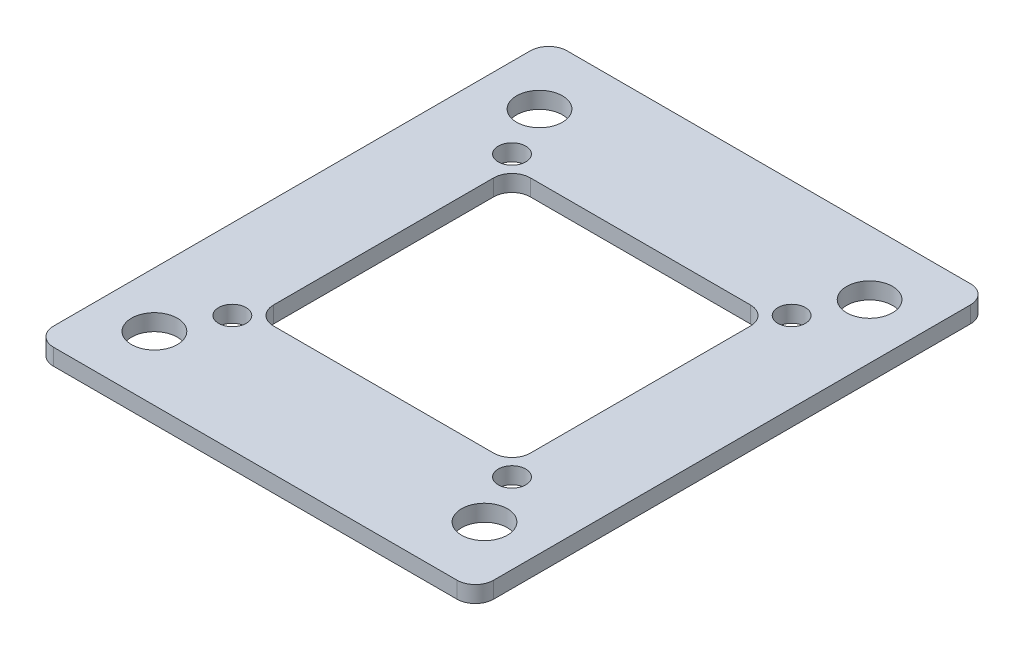
ISO-10303-21;
HEADER;
FILE_DESCRIPTION(('STEP AP214'),'2;1');
FILE_NAME('part.step','',(''),(''),'','','');
FILE_SCHEMA(('AUTOMOTIVE_DESIGN { 1 0 10303 214 1 1 1 1 }'));
ENDSEC;
DATA;
#1=APPLICATION_CONTEXT('core data for automotive mechanical design processes');
#2=APPLICATION_PROTOCOL_DEFINITION('international standard','automotive_design',2000,#1);
#3=PRODUCT_CONTEXT('',#1,'mechanical');
#4=PRODUCT('Part','Part','',(#3));
#5=PRODUCT_RELATED_PRODUCT_CATEGORY('part','',(#4));
#6=PRODUCT_DEFINITION_FORMATION('','',#4);
#7=PRODUCT_DEFINITION_CONTEXT('part definition',#1,'design');
#8=PRODUCT_DEFINITION('design','',#6,#7);
#9=PRODUCT_DEFINITION_SHAPE('','',#8);
#10=(LENGTH_UNIT() NAMED_UNIT(*) SI_UNIT(.MILLI.,.METRE.));
#11=(NAMED_UNIT(*) PLANE_ANGLE_UNIT() SI_UNIT($,.RADIAN.));
#12=(NAMED_UNIT(*) SI_UNIT($,.STERADIAN.) SOLID_ANGLE_UNIT());
#13=UNCERTAINTY_MEASURE_WITH_UNIT(LENGTH_MEASURE(1.E-05),#10,'distance_accuracy_value','');
#14=(GEOMETRIC_REPRESENTATION_CONTEXT(3) GLOBAL_UNCERTAINTY_ASSIGNED_CONTEXT((#13)) GLOBAL_UNIT_ASSIGNED_CONTEXT((#10,
#11,#12)) REPRESENTATION_CONTEXT('',''));
#15=CARTESIAN_POINT('',(0.,0.,0.));
#16=DIRECTION('',(0.,0.,1.));
#17=DIRECTION('',(1.,0.,0.));
#18=AXIS2_PLACEMENT_3D('',#15,#16,#17);
#19=CARTESIAN_POINT('',(0.,1.8,0.));
#20=DIRECTION('',(0.,-1.,0.));
#21=DIRECTION('',(0.,0.,-1.));
#22=AXIS2_PLACEMENT_3D('',#19,#20,#21);
#23=PLANE('',#22);
#24=CARTESIAN_POINT('',(-15.2500000000001,1.8,15.25));
#25=DIRECTION('',(0.,1.,0.));
#26=DIRECTION('',(0.,0.,1.));
#27=AXIS2_PLACEMENT_3D('',#24,#25,#26);
#28=CIRCLE('',#27,1.5);
#29=CARTESIAN_POINT('',(-15.2500000000001,1.8,16.75));
#30=VERTEX_POINT('',#29);
#31=EDGE_CURVE('E320',#30,#30,#28,.T.);
#32=ORIENTED_EDGE('',*,*,#31,.F.);
#33=EDGE_LOOP('',(#32));
#34=FACE_BOUND('',#33,.T.);
#35=CARTESIAN_POINT('',(15.25,1.8,15.25));
#36=DIRECTION('',(0.,1.,0.));
#37=DIRECTION('',(0.,0.,-1.));
#38=AXIS2_PLACEMENT_3D('',#35,#36,#37);
#39=CIRCLE('',#38,1.5);
#40=CARTESIAN_POINT('',(15.25,1.8,13.75));
#41=VERTEX_POINT('',#40);
#42=EDGE_CURVE('E326',#41,#41,#39,.T.);
#43=ORIENTED_EDGE('',*,*,#42,.F.);
#44=EDGE_LOOP('',(#43));
#45=FACE_BOUND('',#44,.T.);
#46=CARTESIAN_POINT('',(-15.2500000000001,1.8,-15.25));
#47=DIRECTION('',(0.,1.,0.));
#48=DIRECTION('',(0.,0.,-1.));
#49=AXIS2_PLACEMENT_3D('',#46,#47,#48);
#50=CIRCLE('',#49,1.5);
#51=CARTESIAN_POINT('',(-15.2500000000001,1.8,-16.75));
#52=VERTEX_POINT('',#51);
#53=EDGE_CURVE('E332',#52,#52,#50,.T.);
#54=ORIENTED_EDGE('',*,*,#53,.F.);
#55=EDGE_LOOP('',(#54));
#56=FACE_BOUND('',#55,.T.);
#57=CARTESIAN_POINT('',(15.25,1.8,-15.25));
#58=DIRECTION('',(0.,1.,0.));
#59=DIRECTION('',(0.,0.,1.));
#60=AXIS2_PLACEMENT_3D('',#57,#58,#59);
#61=CIRCLE('',#60,1.5);
#62=CARTESIAN_POINT('',(15.25,1.8,-13.75));
#63=VERTEX_POINT('',#62);
#64=EDGE_CURVE('E181',#63,#63,#61,.T.);
#65=ORIENTED_EDGE('',*,*,#64,.F.);
#66=EDGE_LOOP('',(#65));
#67=FACE_BOUND('',#66,.T.);
#68=DIRECTION('',(-1.,0.,0.));
#69=VECTOR('',#68,1.);
#70=CARTESIAN_POINT('',(-14.,1.8,-14.));
#71=LINE('',#70,#69);
#72=CARTESIAN_POINT('',(12.,1.8,-14.));
#73=VERTEX_POINT('',#72);
#74=CARTESIAN_POINT('',(-12.,1.8,-14.));
#75=VERTEX_POINT('',#74);
#76=EDGE_CURVE('E174',#73,#75,#71,.T.);
#77=ORIENTED_EDGE('',*,*,#76,.F.);
#78=CARTESIAN_POINT('',(12.,1.8,-12.));
#79=DIRECTION('',(0.,-1.,0.));
#80=DIRECTION('',(0.,0.,-1.));
#81=AXIS2_PLACEMENT_3D('',#78,#79,#80);
#82=CIRCLE('',#81,2.);
#83=CARTESIAN_POINT('',(14.,1.8,-12.));
#84=VERTEX_POINT('',#83);
#85=EDGE_CURVE('E43',#73,#84,#82,.T.);
#86=ORIENTED_EDGE('',*,*,#85,.T.);
#87=DIRECTION('',(0.,0.,-1.));
#88=VECTOR('',#87,1.);
#89=CARTESIAN_POINT('',(14.,1.8,14.));
#90=LINE('',#89,#88);
#91=CARTESIAN_POINT('',(14.,1.8,12.));
#92=VERTEX_POINT('',#91);
#93=EDGE_CURVE('E166',#92,#84,#90,.T.);
#94=ORIENTED_EDGE('',*,*,#93,.F.);
#95=CARTESIAN_POINT('',(12.,1.8,12.));
#96=DIRECTION('',(0.,-1.,0.));
#97=DIRECTION('',(0.,0.,-1.));
#98=AXIS2_PLACEMENT_3D('',#95,#96,#97);
#99=CIRCLE('',#98,2.);
#100=CARTESIAN_POINT('',(12.,1.8,14.));
#101=VERTEX_POINT('',#100);
#102=EDGE_CURVE('E149',#92,#101,#99,.T.);
#103=ORIENTED_EDGE('',*,*,#102,.T.);
#104=DIRECTION('',(1.,0.,0.));
#105=VECTOR('',#104,1.);
#106=CARTESIAN_POINT('',(-14.,1.8,14.));
#107=LINE('',#106,#105);
#108=CARTESIAN_POINT('',(-12.,1.8,14.));
#109=VERTEX_POINT('',#108);
#110=EDGE_CURVE('E189',#109,#101,#107,.T.);
#111=ORIENTED_EDGE('',*,*,#110,.F.);
#112=CARTESIAN_POINT('',(-12.,1.8,12.));
#113=DIRECTION('',(0.,-1.,0.));
#114=DIRECTION('',(0.,0.,-1.));
#115=AXIS2_PLACEMENT_3D('',#112,#113,#114);
#116=CIRCLE('',#115,2.);
#117=CARTESIAN_POINT('',(-14.,1.8,12.));
#118=VERTEX_POINT('',#117);
#119=EDGE_CURVE('E284',#109,#118,#116,.T.);
#120=ORIENTED_EDGE('',*,*,#119,.T.);
#121=DIRECTION('',(0.,0.,1.));
#122=VECTOR('',#121,1.);
#123=CARTESIAN_POINT('',(-14.,1.8,14.));
#124=LINE('',#123,#122);
#125=CARTESIAN_POINT('',(-14.,1.8,-12.));
#126=VERTEX_POINT('',#125);
#127=EDGE_CURVE('E178',#126,#118,#124,.T.);
#128=ORIENTED_EDGE('',*,*,#127,.F.);
#129=CARTESIAN_POINT('',(-12.,1.8,-12.));
#130=DIRECTION('',(0.,-1.,0.));
#131=DIRECTION('',(0.,0.,-1.));
#132=AXIS2_PLACEMENT_3D('',#129,#130,#131);
#133=CIRCLE('',#132,2.);
#134=EDGE_CURVE('E288',#126,#75,#133,.T.);
#135=ORIENTED_EDGE('',*,*,#134,.T.);
#136=EDGE_LOOP('',(#77,#86,#94,#103,#111,#120,#128,#135));
#137=FACE_BOUND('',#136,.T.);
#138=DIRECTION('',(0.,0.,1.));
#139=VECTOR('',#138,1.);
#140=CARTESIAN_POINT('',(-24.,1.8,28.));
#141=LINE('',#140,#139);
#142=CARTESIAN_POINT('',(-24.,1.8,-26.));
#143=VERTEX_POINT('',#142);
#144=CARTESIAN_POINT('',(-24.,1.8,26.));
#145=VERTEX_POINT('',#144);
#146=EDGE_CURVE('E221',#143,#145,#141,.T.);
#147=ORIENTED_EDGE('',*,*,#146,.T.);
#148=CARTESIAN_POINT('',(-22.,1.8,26.));
#149=DIRECTION('',(0.,-1.,0.));
#150=DIRECTION('',(0.,0.,-1.));
#151=AXIS2_PLACEMENT_3D('',#148,#149,#150);
#152=CIRCLE('',#151,2.);
#153=CARTESIAN_POINT('',(-22.,1.8,28.));
#154=VERTEX_POINT('',#153);
#155=EDGE_CURVE('E273',#145,#154,#152,.F.);
#156=ORIENTED_EDGE('',*,*,#155,.T.);
#157=DIRECTION('',(1.,0.,0.));
#158=VECTOR('',#157,1.);
#159=CARTESIAN_POINT('',(-24.,1.8,28.));
#160=LINE('',#159,#158);
#161=CARTESIAN_POINT('',(22.,1.8,28.));
#162=VERTEX_POINT('',#161);
#163=EDGE_CURVE('E224',#154,#162,#160,.T.);
#164=ORIENTED_EDGE('',*,*,#163,.T.);
#165=CARTESIAN_POINT('',(22.,1.8,26.));
#166=DIRECTION('',(0.,-1.,0.));
#167=DIRECTION('',(0.,0.,-1.));
#168=AXIS2_PLACEMENT_3D('',#165,#166,#167);
#169=CIRCLE('',#168,2.);
#170=CARTESIAN_POINT('',(24.,1.8,26.));
#171=VERTEX_POINT('',#170);
#172=EDGE_CURVE('E271',#162,#171,#169,.F.);
#173=ORIENTED_EDGE('',*,*,#172,.T.);
#174=DIRECTION('',(0.,0.,-1.));
#175=VECTOR('',#174,1.);
#176=CARTESIAN_POINT('',(24.,1.8,28.));
#177=LINE('',#176,#175);
#178=CARTESIAN_POINT('',(24.,1.8,-26.));
#179=VERTEX_POINT('',#178);
#180=EDGE_CURVE('E216',#171,#179,#177,.T.);
#181=ORIENTED_EDGE('',*,*,#180,.T.);
#182=CARTESIAN_POINT('',(22.,1.8,-26.));
#183=DIRECTION('',(0.,-1.,0.));
#184=DIRECTION('',(0.,0.,-1.));
#185=AXIS2_PLACEMENT_3D('',#182,#183,#184);
#186=CIRCLE('',#185,2.);
#187=CARTESIAN_POINT('',(22.,1.8,-28.));
#188=VERTEX_POINT('',#187);
#189=EDGE_CURVE('E57',#179,#188,#186,.F.);
#190=ORIENTED_EDGE('',*,*,#189,.T.);
#191=DIRECTION('',(-1.,0.,0.));
#192=VECTOR('',#191,1.);
#193=CARTESIAN_POINT('',(-24.,1.8,-28.));
#194=LINE('',#193,#192);
#195=CARTESIAN_POINT('',(-22.,1.8,-28.));
#196=VERTEX_POINT('',#195);
#197=EDGE_CURVE('E218',#188,#196,#194,.T.);
#198=ORIENTED_EDGE('',*,*,#197,.T.);
#199=CARTESIAN_POINT('',(-22.,1.8,-26.));
#200=DIRECTION('',(0.,-1.,0.));
#201=DIRECTION('',(0.,0.,-1.));
#202=AXIS2_PLACEMENT_3D('',#199,#200,#201);
#203=CIRCLE('',#202,2.);
#204=EDGE_CURVE('E268',#196,#143,#203,.F.);
#205=ORIENTED_EDGE('',*,*,#204,.T.);
#206=EDGE_LOOP('',(#147,#156,#164,#173,#181,#190,#198,#205));
#207=FACE_BOUND('',#206,.T.);
#208=CARTESIAN_POINT('',(-18.,1.8,-21.));
#209=DIRECTION('',(0.,1.,0.));
#210=DIRECTION('',(0.,0.,1.));
#211=AXIS2_PLACEMENT_3D('',#208,#209,#210);
#212=CIRCLE('',#211,2.5);
#213=CARTESIAN_POINT('',(-18.,1.8,-18.5));
#214=VERTEX_POINT('',#213);
#215=EDGE_CURVE('E210',#214,#214,#212,.T.);
#216=ORIENTED_EDGE('',*,*,#215,.F.);
#217=EDGE_LOOP('',(#216));
#218=FACE_BOUND('',#217,.T.);
#219=CARTESIAN_POINT('',(18.,1.8,-21.));
#220=DIRECTION('',(0.,1.,0.));
#221=DIRECTION('',(0.,0.,-1.));
#222=AXIS2_PLACEMENT_3D('',#219,#220,#221);
#223=CIRCLE('',#222,2.5);
#224=CARTESIAN_POINT('',(18.,1.8,-23.5));
#225=VERTEX_POINT('',#224);
#226=EDGE_CURVE('E204',#225,#225,#223,.T.);
#227=ORIENTED_EDGE('',*,*,#226,.F.);
#228=EDGE_LOOP('',(#227));
#229=FACE_BOUND('',#228,.T.);
#230=CARTESIAN_POINT('',(18.,1.8,21.));
#231=DIRECTION('',(0.,1.,0.));
#232=DIRECTION('',(0.,0.,1.));
#233=AXIS2_PLACEMENT_3D('',#230,#231,#232);
#234=CIRCLE('',#233,2.5);
#235=CARTESIAN_POINT('',(18.,1.8,23.5));
#236=VERTEX_POINT('',#235);
#237=EDGE_CURVE('E198',#236,#236,#234,.T.);
#238=ORIENTED_EDGE('',*,*,#237,.F.);
#239=EDGE_LOOP('',(#238));
#240=FACE_BOUND('',#239,.T.);
#241=CARTESIAN_POINT('',(-18.,1.8,21.));
#242=DIRECTION('',(0.,1.,0.));
#243=DIRECTION('',(0.,0.,-1.));
#244=AXIS2_PLACEMENT_3D('',#241,#242,#243);
#245=CIRCLE('',#244,2.5);
#246=CARTESIAN_POINT('',(-18.,1.8,18.5));
#247=VERTEX_POINT('',#246);
#248=EDGE_CURVE('E191',#247,#247,#245,.T.);
#249=ORIENTED_EDGE('',*,*,#248,.F.);
#250=EDGE_LOOP('',(#249));
#251=FACE_BOUND('',#250,.T.);
#252=ADVANCED_FACE('F35',(#34,#45,#56,#67,#137,#207,#218,#229,#240,#251),#23,.F.);
#253=CARTESIAN_POINT('',(0.,0.,0.));
#254=DIRECTION('',(0.,-1.,0.));
#255=DIRECTION('',(0.,0.,-1.));
#256=AXIS2_PLACEMENT_3D('',#253,#254,#255);
#257=PLANE('',#256);
#258=CARTESIAN_POINT('',(-15.2500000000001,0.,15.25));
#259=DIRECTION('',(0.,1.,0.));
#260=DIRECTION('',(0.,0.,1.));
#261=AXIS2_PLACEMENT_3D('',#258,#259,#260);
#262=CIRCLE('',#261,1.5);
#263=CARTESIAN_POINT('',(-15.2500000000001,0.,16.75));
#264=VERTEX_POINT('',#263);
#265=EDGE_CURVE('E323',#264,#264,#262,.T.);
#266=ORIENTED_EDGE('',*,*,#265,.T.);
#267=EDGE_LOOP('',(#266));
#268=FACE_BOUND('',#267,.T.);
#269=CARTESIAN_POINT('',(15.25,0.,15.25));
#270=DIRECTION('',(0.,1.,0.));
#271=DIRECTION('',(0.,0.,-1.));
#272=AXIS2_PLACEMENT_3D('',#269,#270,#271);
#273=CIRCLE('',#272,1.5);
#274=CARTESIAN_POINT('',(15.25,0.,13.75));
#275=VERTEX_POINT('',#274);
#276=EDGE_CURVE('E329',#275,#275,#273,.T.);
#277=ORIENTED_EDGE('',*,*,#276,.T.);
#278=EDGE_LOOP('',(#277));
#279=FACE_BOUND('',#278,.T.);
#280=CARTESIAN_POINT('',(-15.2500000000001,0.,-15.25));
#281=DIRECTION('',(0.,1.,0.));
#282=DIRECTION('',(0.,0.,-1.));
#283=AXIS2_PLACEMENT_3D('',#280,#281,#282);
#284=CIRCLE('',#283,1.5);
#285=CARTESIAN_POINT('',(-15.2500000000001,0.,-16.75));
#286=VERTEX_POINT('',#285);
#287=EDGE_CURVE('E335',#286,#286,#284,.T.);
#288=ORIENTED_EDGE('',*,*,#287,.T.);
#289=EDGE_LOOP('',(#288));
#290=FACE_BOUND('',#289,.T.);
#291=CARTESIAN_POINT('',(15.25,0.,-15.25));
#292=DIRECTION('',(0.,1.,0.));
#293=DIRECTION('',(0.,0.,1.));
#294=AXIS2_PLACEMENT_3D('',#291,#292,#293);
#295=CIRCLE('',#294,1.5);
#296=CARTESIAN_POINT('',(15.25,0.,-13.75));
#297=VERTEX_POINT('',#296);
#298=EDGE_CURVE('E175',#297,#297,#295,.T.);
#299=ORIENTED_EDGE('',*,*,#298,.T.);
#300=EDGE_LOOP('',(#299));
#301=FACE_BOUND('',#300,.T.);
#302=DIRECTION('',(1.,0.,0.));
#303=VECTOR('',#302,1.);
#304=CARTESIAN_POINT('',(-14.,0.,14.));
#305=LINE('',#304,#303);
#306=CARTESIAN_POINT('',(-12.,0.,14.));
#307=VERTEX_POINT('',#306);
#308=CARTESIAN_POINT('',(12.,0.,14.));
#309=VERTEX_POINT('',#308);
#310=EDGE_CURVE('E184',#307,#309,#305,.T.);
#311=ORIENTED_EDGE('',*,*,#310,.T.);
#312=CARTESIAN_POINT('',(12.,0.,12.));
#313=DIRECTION('',(0.,-1.,0.));
#314=DIRECTION('',(0.,0.,-1.));
#315=AXIS2_PLACEMENT_3D('',#312,#313,#314);
#316=CIRCLE('',#315,2.);
#317=CARTESIAN_POINT('',(14.,0.,12.));
#318=VERTEX_POINT('',#317);
#319=EDGE_CURVE('E159',#309,#318,#316,.F.);
#320=ORIENTED_EDGE('',*,*,#319,.T.);
#321=DIRECTION('',(0.,0.,-1.));
#322=VECTOR('',#321,1.);
#323=CARTESIAN_POINT('',(14.,0.,14.));
#324=LINE('',#323,#322);
#325=CARTESIAN_POINT('',(14.,0.,-12.));
#326=VERTEX_POINT('',#325);
#327=EDGE_CURVE('E169',#318,#326,#324,.T.);
#328=ORIENTED_EDGE('',*,*,#327,.T.);
#329=CARTESIAN_POINT('',(12.,0.,-12.));
#330=DIRECTION('',(0.,-1.,0.));
#331=DIRECTION('',(0.,0.,-1.));
#332=AXIS2_PLACEMENT_3D('',#329,#330,#331);
#333=CIRCLE('',#332,2.);
#334=CARTESIAN_POINT('',(12.,0.,-14.));
#335=VERTEX_POINT('',#334);
#336=EDGE_CURVE('E11',#326,#335,#333,.F.);
#337=ORIENTED_EDGE('',*,*,#336,.T.);
#338=DIRECTION('',(-1.,0.,0.));
#339=VECTOR('',#338,1.);
#340=CARTESIAN_POINT('',(-14.,0.,-14.));
#341=LINE('',#340,#339);
#342=CARTESIAN_POINT('',(-12.,0.,-14.));
#343=VERTEX_POINT('',#342);
#344=EDGE_CURVE('E302',#335,#343,#341,.T.);
#345=ORIENTED_EDGE('',*,*,#344,.T.);
#346=CARTESIAN_POINT('',(-12.,0.,-12.));
#347=DIRECTION('',(0.,-1.,0.));
#348=DIRECTION('',(0.,0.,-1.));
#349=AXIS2_PLACEMENT_3D('',#346,#347,#348);
#350=CIRCLE('',#349,2.);
#351=CARTESIAN_POINT('',(-14.,0.,-12.));
#352=VERTEX_POINT('',#351);
#353=EDGE_CURVE('E290',#343,#352,#350,.F.);
#354=ORIENTED_EDGE('',*,*,#353,.T.);
#355=DIRECTION('',(0.,0.,1.));
#356=VECTOR('',#355,1.);
#357=CARTESIAN_POINT('',(-14.,0.,14.));
#358=LINE('',#357,#356);
#359=CARTESIAN_POINT('',(-14.,0.,12.));
#360=VERTEX_POINT('',#359);
#361=EDGE_CURVE('E299',#352,#360,#358,.T.);
#362=ORIENTED_EDGE('',*,*,#361,.T.);
#363=CARTESIAN_POINT('',(-12.,0.,12.));
#364=DIRECTION('',(0.,-1.,0.));
#365=DIRECTION('',(0.,0.,-1.));
#366=AXIS2_PLACEMENT_3D('',#363,#364,#365);
#367=CIRCLE('',#366,2.);
#368=EDGE_CURVE('E286',#360,#307,#367,.F.);
#369=ORIENTED_EDGE('',*,*,#368,.T.);
#370=EDGE_LOOP('',(#311,#320,#328,#337,#345,#354,#362,#369));
#371=FACE_BOUND('',#370,.T.);
#372=CARTESIAN_POINT('',(18.,0.,21.));
#373=DIRECTION('',(0.,1.,0.));
#374=DIRECTION('',(0.,0.,1.));
#375=AXIS2_PLACEMENT_3D('',#372,#373,#374);
#376=CIRCLE('',#375,2.5);
#377=CARTESIAN_POINT('',(18.,0.,23.5));
#378=VERTEX_POINT('',#377);
#379=EDGE_CURVE('E194',#378,#378,#376,.T.);
#380=ORIENTED_EDGE('',*,*,#379,.T.);
#381=EDGE_LOOP('',(#380));
#382=FACE_BOUND('',#381,.T.);
#383=CARTESIAN_POINT('',(-18.,0.,-21.));
#384=DIRECTION('',(0.,1.,0.));
#385=DIRECTION('',(0.,0.,1.));
#386=AXIS2_PLACEMENT_3D('',#383,#384,#385);
#387=CIRCLE('',#386,2.5);
#388=CARTESIAN_POINT('',(-18.,0.,-18.5));
#389=VERTEX_POINT('',#388);
#390=EDGE_CURVE('E207',#389,#389,#387,.T.);
#391=ORIENTED_EDGE('',*,*,#390,.T.);
#392=EDGE_LOOP('',(#391));
#393=FACE_BOUND('',#392,.T.);
#394=DIRECTION('',(1.,0.,0.));
#395=VECTOR('',#394,1.);
#396=CARTESIAN_POINT('',(-24.,0.,28.));
#397=LINE('',#396,#395);
#398=CARTESIAN_POINT('',(-22.,0.,28.));
#399=VERTEX_POINT('',#398);
#400=CARTESIAN_POINT('',(22.,0.,28.));
#401=VERTEX_POINT('',#400);
#402=EDGE_CURVE('E219',#399,#401,#397,.T.);
#403=ORIENTED_EDGE('',*,*,#402,.F.);
#404=CARTESIAN_POINT('',(-22.,0.,26.));
#405=DIRECTION('',(0.,-1.,0.));
#406=DIRECTION('',(0.,0.,-1.));
#407=AXIS2_PLACEMENT_3D('',#404,#405,#406);
#408=CIRCLE('',#407,2.);
#409=CARTESIAN_POINT('',(-24.,0.,26.));
#410=VERTEX_POINT('',#409);
#411=EDGE_CURVE('E261',#399,#410,#408,.T.);
#412=ORIENTED_EDGE('',*,*,#411,.T.);
#413=DIRECTION('',(0.,0.,1.));
#414=VECTOR('',#413,1.);
#415=CARTESIAN_POINT('',(-24.,0.,28.));
#416=LINE('',#415,#414);
#417=CARTESIAN_POINT('',(-24.,0.,-26.));
#418=VERTEX_POINT('',#417);
#419=EDGE_CURVE('E231',#418,#410,#416,.T.);
#420=ORIENTED_EDGE('',*,*,#419,.F.);
#421=CARTESIAN_POINT('',(-22.,0.,-26.));
#422=DIRECTION('',(0.,-1.,0.));
#423=DIRECTION('',(0.,0.,-1.));
#424=AXIS2_PLACEMENT_3D('',#421,#422,#423);
#425=CIRCLE('',#424,2.);
#426=CARTESIAN_POINT('',(-22.,0.,-28.));
#427=VERTEX_POINT('',#426);
#428=EDGE_CURVE('E255',#418,#427,#425,.T.);
#429=ORIENTED_EDGE('',*,*,#428,.T.);
#430=DIRECTION('',(-1.,0.,0.));
#431=VECTOR('',#430,1.);
#432=CARTESIAN_POINT('',(-24.,0.,-28.));
#433=LINE('',#432,#431);
#434=CARTESIAN_POINT('',(22.,0.,-28.));
#435=VERTEX_POINT('',#434);
#436=EDGE_CURVE('E229',#435,#427,#433,.T.);
#437=ORIENTED_EDGE('',*,*,#436,.F.);
#438=CARTESIAN_POINT('',(22.,0.,-26.));
#439=DIRECTION('',(0.,-1.,0.));
#440=DIRECTION('',(0.,0.,-1.));
#441=AXIS2_PLACEMENT_3D('',#438,#439,#440);
#442=CIRCLE('',#441,2.);
#443=CARTESIAN_POINT('',(24.,0.,-26.));
#444=VERTEX_POINT('',#443);
#445=EDGE_CURVE('E257',#435,#444,#442,.T.);
#446=ORIENTED_EDGE('',*,*,#445,.T.);
#447=DIRECTION('',(0.,0.,-1.));
#448=VECTOR('',#447,1.);
#449=CARTESIAN_POINT('',(24.,0.,28.));
#450=LINE('',#449,#448);
#451=CARTESIAN_POINT('',(24.,0.,26.));
#452=VERTEX_POINT('',#451);
#453=EDGE_CURVE('E213',#452,#444,#450,.T.);
#454=ORIENTED_EDGE('',*,*,#453,.F.);
#455=CARTESIAN_POINT('',(22.,0.,26.));
#456=DIRECTION('',(0.,-1.,0.));
#457=DIRECTION('',(0.,0.,-1.));
#458=AXIS2_PLACEMENT_3D('',#455,#456,#457);
#459=CIRCLE('',#458,2.);
#460=EDGE_CURVE('E259',#452,#401,#459,.T.);
#461=ORIENTED_EDGE('',*,*,#460,.T.);
#462=EDGE_LOOP('',(#403,#412,#420,#429,#437,#446,#454,#461));
#463=FACE_BOUND('',#462,.T.);
#464=CARTESIAN_POINT('',(18.,0.,-21.));
#465=DIRECTION('',(0.,1.,0.));
#466=DIRECTION('',(0.,0.,-1.));
#467=AXIS2_PLACEMENT_3D('',#464,#465,#466);
#468=CIRCLE('',#467,2.5);
#469=CARTESIAN_POINT('',(18.,0.,-23.5));
#470=VERTEX_POINT('',#469);
#471=EDGE_CURVE('E201',#470,#470,#468,.T.);
#472=ORIENTED_EDGE('',*,*,#471,.T.);
#473=EDGE_LOOP('',(#472));
#474=FACE_BOUND('',#473,.T.);
#475=CARTESIAN_POINT('',(-18.,0.,21.));
#476=DIRECTION('',(0.,1.,0.));
#477=DIRECTION('',(0.,0.,-1.));
#478=AXIS2_PLACEMENT_3D('',#475,#476,#477);
#479=CIRCLE('',#478,2.5);
#480=CARTESIAN_POINT('',(-18.,0.,18.5));
#481=VERTEX_POINT('',#480);
#482=EDGE_CURVE('E195',#481,#481,#479,.T.);
#483=ORIENTED_EDGE('',*,*,#482,.T.);
#484=EDGE_LOOP('',(#483));
#485=FACE_BOUND('',#484,.T.);
#486=ADVANCED_FACE('F297',(#268,#279,#290,#301,#371,#382,#393,#463,#474,#485),#257,.T.);
#487=CARTESIAN_POINT('',(24.,1.8,28.));
#488=DIRECTION('',(-1.,0.,0.));
#489=DIRECTION('',(0.,0.,1.));
#490=AXIS2_PLACEMENT_3D('',#487,#488,#489);
#491=PLANE('',#490);
#492=ORIENTED_EDGE('',*,*,#180,.F.);
#493=DIRECTION('',(0.,-1.,0.));
#494=VECTOR('',#493,1.);
#495=CARTESIAN_POINT('',(24.,1.8,26.));
#496=LINE('',#495,#494);
#497=EDGE_CURVE('E277',#171,#452,#496,.T.);
#498=ORIENTED_EDGE('',*,*,#497,.T.);
#499=ORIENTED_EDGE('',*,*,#453,.T.);
#500=DIRECTION('',(0.,-1.,0.));
#501=VECTOR('',#500,1.);
#502=CARTESIAN_POINT('',(24.,1.8,-26.));
#503=LINE('',#502,#501);
#504=EDGE_CURVE('E275',#444,#179,#503,.F.);
#505=ORIENTED_EDGE('',*,*,#504,.T.);
#506=EDGE_LOOP('',(#492,#498,#499,#505));
#507=FACE_BOUND('',#506,.T.);
#508=ADVANCED_FACE('F349',(#507),#491,.F.);
#509=CARTESIAN_POINT('',(-24.,1.8,-28.));
#510=DIRECTION('',(0.,0.,1.));
#511=DIRECTION('',(1.,0.,0.));
#512=AXIS2_PLACEMENT_3D('',#509,#510,#511);
#513=PLANE('',#512);
#514=ORIENTED_EDGE('',*,*,#197,.F.);
#515=DIRECTION('',(0.,-1.,0.));
#516=VECTOR('',#515,1.);
#517=CARTESIAN_POINT('',(22.,1.8,-28.));
#518=LINE('',#517,#516);
#519=EDGE_CURVE('E160',#188,#435,#518,.T.);
#520=ORIENTED_EDGE('',*,*,#519,.T.);
#521=ORIENTED_EDGE('',*,*,#436,.T.);
#522=DIRECTION('',(0.,-1.,0.));
#523=VECTOR('',#522,1.);
#524=CARTESIAN_POINT('',(-22.,1.8,-28.));
#525=LINE('',#524,#523);
#526=EDGE_CURVE('E50',#427,#196,#525,.F.);
#527=ORIENTED_EDGE('',*,*,#526,.T.);
#528=EDGE_LOOP('',(#514,#520,#521,#527));
#529=FACE_BOUND('',#528,.T.);
#530=ADVANCED_FACE('F365',(#529),#513,.F.);
#531=CARTESIAN_POINT('',(-24.,1.8,28.));
#532=DIRECTION('',(1.,0.,0.));
#533=DIRECTION('',(0.,0.,-1.));
#534=AXIS2_PLACEMENT_3D('',#531,#532,#533);
#535=PLANE('',#534);
#536=ORIENTED_EDGE('',*,*,#419,.T.);
#537=DIRECTION('',(0.,-1.,0.));
#538=VECTOR('',#537,1.);
#539=CARTESIAN_POINT('',(-24.,1.8,26.));
#540=LINE('',#539,#538);
#541=EDGE_CURVE('E266',#410,#145,#540,.F.);
#542=ORIENTED_EDGE('',*,*,#541,.T.);
#543=ORIENTED_EDGE('',*,*,#146,.F.);
#544=DIRECTION('',(0.,-1.,0.));
#545=VECTOR('',#544,1.);
#546=CARTESIAN_POINT('',(-24.,1.8,-26.));
#547=LINE('',#546,#545);
#548=EDGE_CURVE('E263',#143,#418,#547,.T.);
#549=ORIENTED_EDGE('',*,*,#548,.T.);
#550=EDGE_LOOP('',(#536,#542,#543,#549));
#551=FACE_BOUND('',#550,.T.);
#552=ADVANCED_FACE('F361',(#551),#535,.F.);
#553=CARTESIAN_POINT('',(-24.,1.8,28.));
#554=DIRECTION('',(0.,0.,-1.));
#555=DIRECTION('',(-1.,0.,0.));
#556=AXIS2_PLACEMENT_3D('',#553,#554,#555);
#557=PLANE('',#556);
#558=ORIENTED_EDGE('',*,*,#163,.F.);
#559=DIRECTION('',(0.,-1.,0.));
#560=VECTOR('',#559,1.);
#561=CARTESIAN_POINT('',(-22.,1.8,28.));
#562=LINE('',#561,#560);
#563=EDGE_CURVE('E252',#154,#399,#562,.T.);
#564=ORIENTED_EDGE('',*,*,#563,.T.);
#565=ORIENTED_EDGE('',*,*,#402,.T.);
#566=DIRECTION('',(0.,-1.,0.));
#567=VECTOR('',#566,1.);
#568=CARTESIAN_POINT('',(22.,1.8,28.));
#569=LINE('',#568,#567);
#570=EDGE_CURVE('E250',#401,#162,#569,.F.);
#571=ORIENTED_EDGE('',*,*,#570,.T.);
#572=EDGE_LOOP('',(#558,#564,#565,#571));
#573=FACE_BOUND('',#572,.T.);
#574=ADVANCED_FACE('F358',(#573),#557,.F.);
#575=CARTESIAN_POINT('',(-18.,1.8,-21.));
#576=DIRECTION('',(0.,-1.,0.));
#577=DIRECTION('',(0.,0.,-1.));
#578=AXIS2_PLACEMENT_3D('',#575,#576,#577);
#579=CYLINDRICAL_SURFACE('',#578,2.5);
#580=ORIENTED_EDGE('',*,*,#215,.T.);
#581=EDGE_LOOP('',(#580));
#582=FACE_BOUND('',#581,.T.);
#583=ORIENTED_EDGE('',*,*,#390,.F.);
#584=EDGE_LOOP('',(#583));
#585=FACE_BOUND('',#584,.T.);
#586=ADVANCED_FACE('F355',(#582,#585),#579,.F.);
#587=CARTESIAN_POINT('',(18.,1.8,-21.));
#588=DIRECTION('',(0.,-1.,0.));
#589=DIRECTION('',(0.,0.,-1.));
#590=AXIS2_PLACEMENT_3D('',#587,#588,#589);
#591=CYLINDRICAL_SURFACE('',#590,2.5);
#592=ORIENTED_EDGE('',*,*,#226,.T.);
#593=EDGE_LOOP('',(#592));
#594=FACE_BOUND('',#593,.T.);
#595=ORIENTED_EDGE('',*,*,#471,.F.);
#596=EDGE_LOOP('',(#595));
#597=FACE_BOUND('',#596,.T.);
#598=ADVANCED_FACE('F438',(#594,#597),#591,.F.);
#599=CARTESIAN_POINT('',(18.,1.8,21.));
#600=DIRECTION('',(0.,-1.,0.));
#601=DIRECTION('',(0.,0.,-1.));
#602=AXIS2_PLACEMENT_3D('',#599,#600,#601);
#603=CYLINDRICAL_SURFACE('',#602,2.5);
#604=ORIENTED_EDGE('',*,*,#237,.T.);
#605=EDGE_LOOP('',(#604));
#606=FACE_BOUND('',#605,.T.);
#607=ORIENTED_EDGE('',*,*,#379,.F.);
#608=EDGE_LOOP('',(#607));
#609=FACE_BOUND('',#608,.T.);
#610=ADVANCED_FACE('F428',(#606,#609),#603,.F.);
#611=CARTESIAN_POINT('',(-18.,1.8,21.));
#612=DIRECTION('',(0.,-1.,0.));
#613=DIRECTION('',(0.,0.,-1.));
#614=AXIS2_PLACEMENT_3D('',#611,#612,#613);
#615=CYLINDRICAL_SURFACE('',#614,2.5);
#616=ORIENTED_EDGE('',*,*,#248,.T.);
#617=EDGE_LOOP('',(#616));
#618=FACE_BOUND('',#617,.T.);
#619=ORIENTED_EDGE('',*,*,#482,.F.);
#620=EDGE_LOOP('',(#619));
#621=FACE_BOUND('',#620,.T.);
#622=ADVANCED_FACE('F425',(#618,#621),#615,.F.);
#623=CARTESIAN_POINT('',(14.,0.,14.));
#624=DIRECTION('',(1.,0.,0.));
#625=DIRECTION('',(0.,0.,-1.));
#626=AXIS2_PLACEMENT_3D('',#623,#624,#625);
#627=PLANE('',#626);
#628=ORIENTED_EDGE('',*,*,#327,.F.);
#629=DIRECTION('',(0.,1.,0.));
#630=VECTOR('',#629,1.);
#631=CARTESIAN_POINT('',(14.,1.8,12.));
#632=LINE('',#631,#630);
#633=EDGE_CURVE('E153',#318,#92,#632,.T.);
#634=ORIENTED_EDGE('',*,*,#633,.T.);
#635=ORIENTED_EDGE('',*,*,#93,.T.);
#636=DIRECTION('',(0.,1.,0.));
#637=VECTOR('',#636,1.);
#638=CARTESIAN_POINT('',(14.,0.,-12.));
#639=LINE('',#638,#637);
#640=EDGE_CURVE('E171',#84,#326,#639,.F.);
#641=ORIENTED_EDGE('',*,*,#640,.T.);
#642=EDGE_LOOP('',(#628,#634,#635,#641));
#643=FACE_BOUND('',#642,.T.);
#644=ADVANCED_FACE('F165',(#643),#627,.F.);
#645=CARTESIAN_POINT('',(-14.,0.,14.));
#646=DIRECTION('',(0.,0.,1.));
#647=DIRECTION('',(1.,0.,0.));
#648=AXIS2_PLACEMENT_3D('',#645,#646,#647);
#649=PLANE('',#648);
#650=ORIENTED_EDGE('',*,*,#110,.T.);
#651=DIRECTION('',(0.,1.,0.));
#652=VECTOR('',#651,1.);
#653=CARTESIAN_POINT('',(12.,0.,14.));
#654=LINE('',#653,#652);
#655=EDGE_CURVE('E154',#101,#309,#654,.F.);
#656=ORIENTED_EDGE('',*,*,#655,.T.);
#657=ORIENTED_EDGE('',*,*,#310,.F.);
#658=DIRECTION('',(0.,1.,0.));
#659=VECTOR('',#658,1.);
#660=CARTESIAN_POINT('',(-12.,1.8,14.));
#661=LINE('',#660,#659);
#662=EDGE_CURVE('E170',#307,#109,#661,.T.);
#663=ORIENTED_EDGE('',*,*,#662,.T.);
#664=EDGE_LOOP('',(#650,#656,#657,#663));
#665=FACE_BOUND('',#664,.T.);
#666=ADVANCED_FACE('F436',(#665),#649,.F.);
#667=CARTESIAN_POINT('',(-14.,0.,14.));
#668=DIRECTION('',(-1.,0.,0.));
#669=DIRECTION('',(0.,0.,1.));
#670=AXIS2_PLACEMENT_3D('',#667,#668,#669);
#671=PLANE('',#670);
#672=ORIENTED_EDGE('',*,*,#127,.T.);
#673=DIRECTION('',(0.,1.,0.));
#674=VECTOR('',#673,1.);
#675=CARTESIAN_POINT('',(-14.,0.,12.));
#676=LINE('',#675,#674);
#677=EDGE_CURVE('E243',#118,#360,#676,.F.);
#678=ORIENTED_EDGE('',*,*,#677,.T.);
#679=ORIENTED_EDGE('',*,*,#361,.F.);
#680=DIRECTION('',(0.,1.,0.));
#681=VECTOR('',#680,1.);
#682=CARTESIAN_POINT('',(-14.,1.8,-12.));
#683=LINE('',#682,#681);
#684=EDGE_CURVE('E240',#352,#126,#683,.T.);
#685=ORIENTED_EDGE('',*,*,#684,.T.);
#686=EDGE_LOOP('',(#672,#678,#679,#685));
#687=FACE_BOUND('',#686,.T.);
#688=ADVANCED_FACE('F307',(#687),#671,.F.);
#689=CARTESIAN_POINT('',(-14.,0.,-14.));
#690=DIRECTION('',(0.,0.,-1.));
#691=DIRECTION('',(-1.,0.,0.));
#692=AXIS2_PLACEMENT_3D('',#689,#690,#691);
#693=PLANE('',#692);
#694=ORIENTED_EDGE('',*,*,#76,.T.);
#695=DIRECTION('',(0.,1.,0.));
#696=VECTOR('',#695,1.);
#697=CARTESIAN_POINT('',(-12.,0.,-14.));
#698=LINE('',#697,#696);
#699=EDGE_CURVE('E248',#75,#343,#698,.F.);
#700=ORIENTED_EDGE('',*,*,#699,.T.);
#701=ORIENTED_EDGE('',*,*,#344,.F.);
#702=DIRECTION('',(0.,1.,0.));
#703=VECTOR('',#702,1.);
#704=CARTESIAN_POINT('',(12.,1.8,-14.));
#705=LINE('',#704,#703);
#706=EDGE_CURVE('E245',#335,#73,#705,.T.);
#707=ORIENTED_EDGE('',*,*,#706,.T.);
#708=EDGE_LOOP('',(#694,#700,#701,#707));
#709=FACE_BOUND('',#708,.T.);
#710=ADVANCED_FACE('F312',(#709),#693,.F.);
#711=CARTESIAN_POINT('',(15.25,0.,-15.25));
#712=DIRECTION('',(0.,1.,0.));
#713=DIRECTION('',(0.,0.,1.));
#714=AXIS2_PLACEMENT_3D('',#711,#712,#713);
#715=CYLINDRICAL_SURFACE('',#714,1.5);
#716=ORIENTED_EDGE('',*,*,#298,.F.);
#717=EDGE_LOOP('',(#716));
#718=FACE_BOUND('',#717,.T.);
#719=ORIENTED_EDGE('',*,*,#64,.T.);
#720=EDGE_LOOP('',(#719));
#721=FACE_BOUND('',#720,.T.);
#722=ADVANCED_FACE('F341',(#718,#721),#715,.F.);
#723=CARTESIAN_POINT('',(-15.2500000000001,0.,-15.25));
#724=DIRECTION('',(0.,1.,0.));
#725=DIRECTION('',(0.,0.,1.));
#726=AXIS2_PLACEMENT_3D('',#723,#724,#725);
#727=CYLINDRICAL_SURFACE('',#726,1.5);
#728=ORIENTED_EDGE('',*,*,#287,.F.);
#729=EDGE_LOOP('',(#728));
#730=FACE_BOUND('',#729,.T.);
#731=ORIENTED_EDGE('',*,*,#53,.T.);
#732=EDGE_LOOP('',(#731));
#733=FACE_BOUND('',#732,.T.);
#734=ADVANCED_FACE('F500',(#730,#733),#727,.F.);
#735=CARTESIAN_POINT('',(15.25,0.,15.25));
#736=DIRECTION('',(0.,1.,0.));
#737=DIRECTION('',(0.,0.,1.));
#738=AXIS2_PLACEMENT_3D('',#735,#736,#737);
#739=CYLINDRICAL_SURFACE('',#738,1.5);
#740=ORIENTED_EDGE('',*,*,#276,.F.);
#741=EDGE_LOOP('',(#740));
#742=FACE_BOUND('',#741,.T.);
#743=ORIENTED_EDGE('',*,*,#42,.T.);
#744=EDGE_LOOP('',(#743));
#745=FACE_BOUND('',#744,.T.);
#746=ADVANCED_FACE('F489',(#742,#745),#739,.F.);
#747=CARTESIAN_POINT('',(-15.2500000000001,0.,15.25));
#748=DIRECTION('',(0.,1.,0.));
#749=DIRECTION('',(0.,0.,1.));
#750=AXIS2_PLACEMENT_3D('',#747,#748,#749);
#751=CYLINDRICAL_SURFACE('',#750,1.5);
#752=ORIENTED_EDGE('',*,*,#265,.F.);
#753=EDGE_LOOP('',(#752));
#754=FACE_BOUND('',#753,.T.);
#755=ORIENTED_EDGE('',*,*,#31,.T.);
#756=EDGE_LOOP('',(#755));
#757=FACE_BOUND('',#756,.T.);
#758=ADVANCED_FACE('F375',(#754,#757),#751,.F.);
#759=CARTESIAN_POINT('',(12.,0.,12.));
#760=DIRECTION('',(0.,-1.,0.));
#761=DIRECTION('',(0.,0.,-1.));
#762=AXIS2_PLACEMENT_3D('',#759,#760,#761);
#763=CYLINDRICAL_SURFACE('',#762,2.);
#764=ORIENTED_EDGE('',*,*,#319,.F.);
#765=ORIENTED_EDGE('',*,*,#655,.F.);
#766=ORIENTED_EDGE('',*,*,#102,.F.);
#767=ORIENTED_EDGE('',*,*,#633,.F.);
#768=EDGE_LOOP('',(#764,#765,#766,#767));
#769=FACE_BOUND('',#768,.T.);
#770=ADVANCED_FACE('F152',(#769),#763,.F.);
#771=CARTESIAN_POINT('',(-12.,0.,12.));
#772=DIRECTION('',(0.,-1.,0.));
#773=DIRECTION('',(0.,0.,-1.));
#774=AXIS2_PLACEMENT_3D('',#771,#772,#773);
#775=CYLINDRICAL_SURFACE('',#774,2.);
#776=ORIENTED_EDGE('',*,*,#368,.F.);
#777=ORIENTED_EDGE('',*,*,#677,.F.);
#778=ORIENTED_EDGE('',*,*,#119,.F.);
#779=ORIENTED_EDGE('',*,*,#662,.F.);
#780=EDGE_LOOP('',(#776,#777,#778,#779));
#781=FACE_BOUND('',#780,.T.);
#782=ADVANCED_FACE('F374',(#781),#775,.F.);
#783=CARTESIAN_POINT('',(-12.,0.,-12.));
#784=DIRECTION('',(0.,-1.,0.));
#785=DIRECTION('',(0.,0.,-1.));
#786=AXIS2_PLACEMENT_3D('',#783,#784,#785);
#787=CYLINDRICAL_SURFACE('',#786,2.);
#788=ORIENTED_EDGE('',*,*,#353,.F.);
#789=ORIENTED_EDGE('',*,*,#699,.F.);
#790=ORIENTED_EDGE('',*,*,#134,.F.);
#791=ORIENTED_EDGE('',*,*,#684,.F.);
#792=EDGE_LOOP('',(#788,#789,#790,#791));
#793=FACE_BOUND('',#792,.T.);
#794=ADVANCED_FACE('F310',(#793),#787,.F.);
#795=CARTESIAN_POINT('',(12.,0.,-12.));
#796=DIRECTION('',(0.,-1.,0.));
#797=DIRECTION('',(0.,0.,-1.));
#798=AXIS2_PLACEMENT_3D('',#795,#796,#797);
#799=CYLINDRICAL_SURFACE('',#798,2.);
#800=ORIENTED_EDGE('',*,*,#336,.F.);
#801=ORIENTED_EDGE('',*,*,#640,.F.);
#802=ORIENTED_EDGE('',*,*,#85,.F.);
#803=ORIENTED_EDGE('',*,*,#706,.F.);
#804=EDGE_LOOP('',(#800,#801,#802,#803));
#805=FACE_BOUND('',#804,.T.);
#806=ADVANCED_FACE('F316',(#805),#799,.F.);
#807=CARTESIAN_POINT('',(-22.,1.8,26.));
#808=DIRECTION('',(0.,-1.,0.));
#809=DIRECTION('',(0.,0.,-1.));
#810=AXIS2_PLACEMENT_3D('',#807,#808,#809);
#811=CYLINDRICAL_SURFACE('',#810,2.);
#812=ORIENTED_EDGE('',*,*,#155,.F.);
#813=ORIENTED_EDGE('',*,*,#541,.F.);
#814=ORIENTED_EDGE('',*,*,#411,.F.);
#815=ORIENTED_EDGE('',*,*,#563,.F.);
#816=EDGE_LOOP('',(#812,#813,#814,#815));
#817=FACE_BOUND('',#816,.T.);
#818=ADVANCED_FACE('F383',(#817),#811,.T.);
#819=CARTESIAN_POINT('',(22.,1.8,26.));
#820=DIRECTION('',(0.,-1.,0.));
#821=DIRECTION('',(0.,0.,-1.));
#822=AXIS2_PLACEMENT_3D('',#819,#820,#821);
#823=CYLINDRICAL_SURFACE('',#822,2.);
#824=ORIENTED_EDGE('',*,*,#172,.F.);
#825=ORIENTED_EDGE('',*,*,#570,.F.);
#826=ORIENTED_EDGE('',*,*,#460,.F.);
#827=ORIENTED_EDGE('',*,*,#497,.F.);
#828=EDGE_LOOP('',(#824,#825,#826,#827));
#829=FACE_BOUND('',#828,.T.);
#830=ADVANCED_FACE('F386',(#829),#823,.T.);
#831=CARTESIAN_POINT('',(22.,1.8,-26.));
#832=DIRECTION('',(0.,-1.,0.));
#833=DIRECTION('',(0.,0.,-1.));
#834=AXIS2_PLACEMENT_3D('',#831,#832,#833);
#835=CYLINDRICAL_SURFACE('',#834,2.);
#836=ORIENTED_EDGE('',*,*,#189,.F.);
#837=ORIENTED_EDGE('',*,*,#504,.F.);
#838=ORIENTED_EDGE('',*,*,#445,.F.);
#839=ORIENTED_EDGE('',*,*,#519,.F.);
#840=EDGE_LOOP('',(#836,#837,#838,#839));
#841=FACE_BOUND('',#840,.T.);
#842=ADVANCED_FACE('F389',(#841),#835,.T.);
#843=CARTESIAN_POINT('',(-22.,1.8,-26.));
#844=DIRECTION('',(0.,-1.,0.));
#845=DIRECTION('',(0.,0.,-1.));
#846=AXIS2_PLACEMENT_3D('',#843,#844,#845);
#847=CYLINDRICAL_SURFACE('',#846,2.);
#848=ORIENTED_EDGE('',*,*,#204,.F.);
#849=ORIENTED_EDGE('',*,*,#526,.F.);
#850=ORIENTED_EDGE('',*,*,#428,.F.);
#851=ORIENTED_EDGE('',*,*,#548,.F.);
#852=EDGE_LOOP('',(#848,#849,#850,#851));
#853=FACE_BOUND('',#852,.T.);
#854=ADVANCED_FACE('F37',(#853),#847,.T.);
#855=CLOSED_SHELL('',(#252,#486,#508,#530,#552,#574,#586,#598,#610,#622,#644,#666,#688,#710,
#722,#734,#746,#758,#770,#782,#794,#806,#818,#830,#842,#854));
#856=MANIFOLD_SOLID_BREP('B2',#855);
#857=ADVANCED_BREP_SHAPE_REPRESENTATION('',(#18,#856),#14);
#858=SHAPE_DEFINITION_REPRESENTATION(#9,#857);
ENDSEC;
END-ISO-10303-21;
